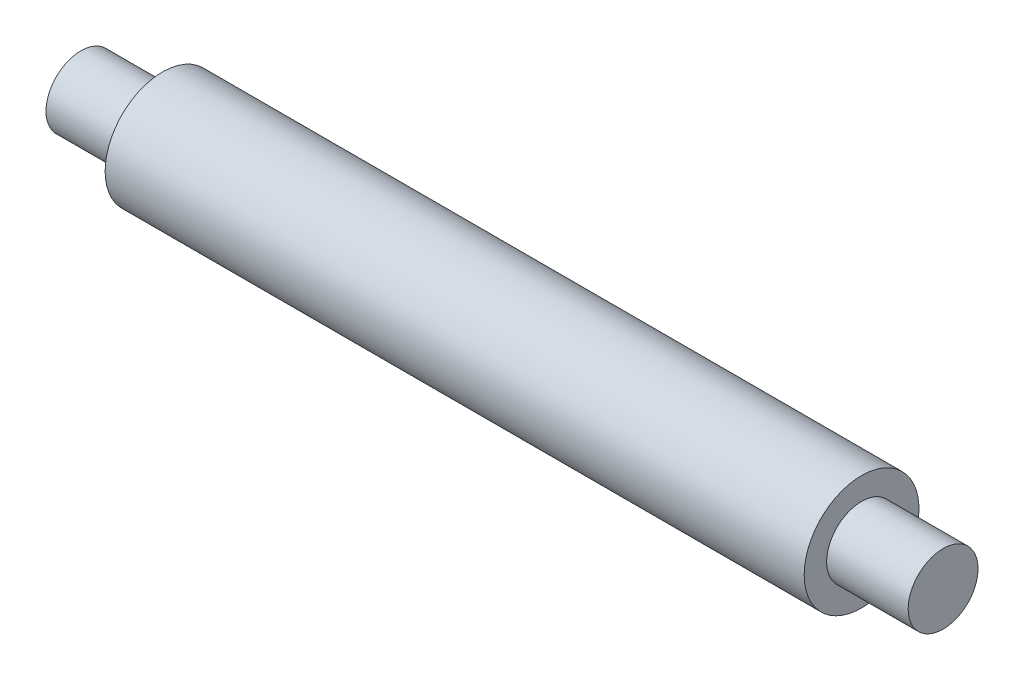
ISO-10303-21;
HEADER;
FILE_DESCRIPTION(('STEP AP214'),'2;1');
FILE_NAME('part.step','',(''),(''),'','','');
FILE_SCHEMA(('AUTOMOTIVE_DESIGN { 1 0 10303 214 1 1 1 1 }'));
ENDSEC;
DATA;
#1=APPLICATION_CONTEXT('core data for automotive mechanical design processes');
#2=APPLICATION_PROTOCOL_DEFINITION('international standard','automotive_design',2000,#1);
#3=PRODUCT_CONTEXT('',#1,'mechanical');
#4=PRODUCT('Part','Part','',(#3));
#5=PRODUCT_RELATED_PRODUCT_CATEGORY('part','',(#4));
#6=PRODUCT_DEFINITION_FORMATION('','',#4);
#7=PRODUCT_DEFINITION_CONTEXT('part definition',#1,'design');
#8=PRODUCT_DEFINITION('design','',#6,#7);
#9=PRODUCT_DEFINITION_SHAPE('','',#8);
#10=(LENGTH_UNIT() NAMED_UNIT(*) SI_UNIT(.MILLI.,.METRE.));
#11=(NAMED_UNIT(*) PLANE_ANGLE_UNIT() SI_UNIT($,.RADIAN.));
#12=(NAMED_UNIT(*) SI_UNIT($,.STERADIAN.) SOLID_ANGLE_UNIT());
#13=UNCERTAINTY_MEASURE_WITH_UNIT(LENGTH_MEASURE(1.E-05),#10,'distance_accuracy_value','');
#14=(GEOMETRIC_REPRESENTATION_CONTEXT(3) GLOBAL_UNCERTAINTY_ASSIGNED_CONTEXT((#13)) GLOBAL_UNIT_ASSIGNED_CONTEXT((#10,
#11,#12)) REPRESENTATION_CONTEXT('',''));
#15=CARTESIAN_POINT('',(0.,0.,0.));
#16=DIRECTION('',(0.,0.,1.));
#17=DIRECTION('',(1.,0.,0.));
#18=AXIS2_PLACEMENT_3D('',#15,#16,#17);
#19=CARTESIAN_POINT('',(0.,1.5,0.));
#20=DIRECTION('',(1.,0.,0.));
#21=DIRECTION('',(0.,0.,-1.));
#22=AXIS2_PLACEMENT_3D('',#19,#20,#21);
#23=PLANE('',#22);
#24=CARTESIAN_POINT('',(0.,0.,0.));
#25=DIRECTION('',(-1.,0.,0.));
#26=DIRECTION('',(0.,0.,1.));
#27=AXIS2_PLACEMENT_3D('',#24,#25,#26);
#28=CIRCLE('',#27,1.5);
#29=CARTESIAN_POINT('',(0.,0.,1.5));
#30=VERTEX_POINT('',#29);
#31=EDGE_CURVE('E53',#30,#30,#28,.T.);
#32=ORIENTED_EDGE('',*,*,#31,.T.);
#33=EDGE_LOOP('',(#32));
#34=FACE_BOUND('',#33,.T.);
#35=ADVANCED_FACE('F31',(#34),#23,.F.);
#36=CARTESIAN_POINT('',(37.,0.,0.));
#37=DIRECTION('',(-1.,0.,0.));
#38=DIRECTION('',(0.,0.,1.));
#39=AXIS2_PLACEMENT_3D('',#36,#37,#38);
#40=PLANE('',#39);
#41=CARTESIAN_POINT('',(37.,0.,0.));
#42=DIRECTION('',(-1.,0.,0.));
#43=DIRECTION('',(0.,0.,1.));
#44=AXIS2_PLACEMENT_3D('',#41,#42,#43);
#45=CIRCLE('',#44,1.5);
#46=CARTESIAN_POINT('',(37.,0.,1.5));
#47=VERTEX_POINT('',#46);
#48=EDGE_CURVE('E10',#47,#47,#45,.T.);
#49=ORIENTED_EDGE('',*,*,#48,.F.);
#50=EDGE_LOOP('',(#49));
#51=FACE_BOUND('',#50,.T.);
#52=ADVANCED_FACE('F83',(#51),#40,.F.);
#53=CARTESIAN_POINT('',(0.,0.,0.));
#54=DIRECTION('',(-1.,0.,0.));
#55=DIRECTION('',(0.,0.,1.));
#56=AXIS2_PLACEMENT_3D('',#53,#54,#55);
#57=CYLINDRICAL_SURFACE('',#56,1.5);
#58=CARTESIAN_POINT('',(33.5,0.,0.));
#59=DIRECTION('',(-1.,0.,0.));
#60=DIRECTION('',(0.,0.,1.));
#61=AXIS2_PLACEMENT_3D('',#58,#59,#60);
#62=CIRCLE('',#61,1.5);
#63=CARTESIAN_POINT('',(33.5,0.,1.5));
#64=VERTEX_POINT('',#63);
#65=EDGE_CURVE('E37',#64,#64,#62,.T.);
#66=ORIENTED_EDGE('',*,*,#65,.F.);
#67=EDGE_LOOP('',(#66));
#68=FACE_BOUND('',#67,.T.);
#69=ORIENTED_EDGE('',*,*,#48,.T.);
#70=EDGE_LOOP('',(#69));
#71=FACE_BOUND('',#70,.T.);
#72=ADVANCED_FACE('F78',(#68,#71),#57,.T.);
#73=CARTESIAN_POINT('',(33.5,1.5,0.));
#74=DIRECTION('',(-1.,0.,0.));
#75=DIRECTION('',(0.,0.,1.));
#76=AXIS2_PLACEMENT_3D('',#73,#74,#75);
#77=PLANE('',#76);
#78=CARTESIAN_POINT('',(33.5,0.,0.));
#79=DIRECTION('',(-1.,0.,0.));
#80=DIRECTION('',(0.,0.,1.));
#81=AXIS2_PLACEMENT_3D('',#78,#79,#80);
#82=CIRCLE('',#81,2.46254968584782);
#83=CARTESIAN_POINT('',(33.5,0.,2.46254968584782));
#84=VERTEX_POINT('',#83);
#85=EDGE_CURVE('E41',#84,#84,#82,.T.);
#86=ORIENTED_EDGE('',*,*,#85,.F.);
#87=EDGE_LOOP('',(#86));
#88=FACE_BOUND('',#87,.T.);
#89=ORIENTED_EDGE('',*,*,#65,.T.);
#90=EDGE_LOOP('',(#89));
#91=FACE_BOUND('',#90,.T.);
#92=ADVANCED_FACE('F73',(#88,#91),#77,.F.);
#93=CARTESIAN_POINT('',(0.,0.,0.));
#94=DIRECTION('',(-1.,0.,0.));
#95=DIRECTION('',(0.,0.,1.));
#96=AXIS2_PLACEMENT_3D('',#93,#94,#95);
#97=CYLINDRICAL_SURFACE('',#96,2.46254968584782);
#98=CARTESIAN_POINT('',(3.50000000000001,0.,0.));
#99=DIRECTION('',(-1.,0.,0.));
#100=DIRECTION('',(0.,0.,1.));
#101=AXIS2_PLACEMENT_3D('',#98,#99,#100);
#102=CIRCLE('',#101,2.46254968584782);
#103=CARTESIAN_POINT('',(3.50000000000001,0.,2.46254968584782));
#104=VERTEX_POINT('',#103);
#105=EDGE_CURVE('E45',#104,#104,#102,.T.);
#106=ORIENTED_EDGE('',*,*,#105,.F.);
#107=EDGE_LOOP('',(#106));
#108=FACE_BOUND('',#107,.T.);
#109=ORIENTED_EDGE('',*,*,#85,.T.);
#110=EDGE_LOOP('',(#109));
#111=FACE_BOUND('',#110,.T.);
#112=ADVANCED_FACE('F67',(#108,#111),#97,.T.);
#113=CARTESIAN_POINT('',(3.50000000000001,2.46254968584782,0.));
#114=DIRECTION('',(1.,0.,0.));
#115=DIRECTION('',(0.,0.,-1.));
#116=AXIS2_PLACEMENT_3D('',#113,#114,#115);
#117=PLANE('',#116);
#118=CARTESIAN_POINT('',(3.50000000000001,0.,0.));
#119=DIRECTION('',(-1.,0.,0.));
#120=DIRECTION('',(0.,0.,1.));
#121=AXIS2_PLACEMENT_3D('',#118,#119,#120);
#122=CIRCLE('',#121,1.5);
#123=CARTESIAN_POINT('',(3.50000000000001,0.,1.5));
#124=VERTEX_POINT('',#123);
#125=EDGE_CURVE('E50',#124,#124,#122,.T.);
#126=ORIENTED_EDGE('',*,*,#125,.F.);
#127=EDGE_LOOP('',(#126));
#128=FACE_BOUND('',#127,.T.);
#129=ORIENTED_EDGE('',*,*,#105,.T.);
#130=EDGE_LOOP('',(#129));
#131=FACE_BOUND('',#130,.T.);
#132=ADVANCED_FACE('F61',(#128,#131),#117,.F.);
#133=CARTESIAN_POINT('',(0.,0.,0.));
#134=DIRECTION('',(-1.,0.,0.));
#135=DIRECTION('',(0.,0.,1.));
#136=AXIS2_PLACEMENT_3D('',#133,#134,#135);
#137=CYLINDRICAL_SURFACE('',#136,1.5);
#138=ORIENTED_EDGE('',*,*,#31,.F.);
#139=EDGE_LOOP('',(#138));
#140=FACE_BOUND('',#139,.T.);
#141=ORIENTED_EDGE('',*,*,#125,.T.);
#142=EDGE_LOOP('',(#141));
#143=FACE_BOUND('',#142,.T.);
#144=ADVANCED_FACE('F58',(#140,#143),#137,.T.);
#145=CLOSED_SHELL('',(#35,#52,#72,#92,#112,#132,#144));
#146=MANIFOLD_SOLID_BREP('B2',#145);
#147=ADVANCED_BREP_SHAPE_REPRESENTATION('',(#18,#146),#14);
#148=SHAPE_DEFINITION_REPRESENTATION(#9,#147);
ENDSEC;
END-ISO-10303-21;
